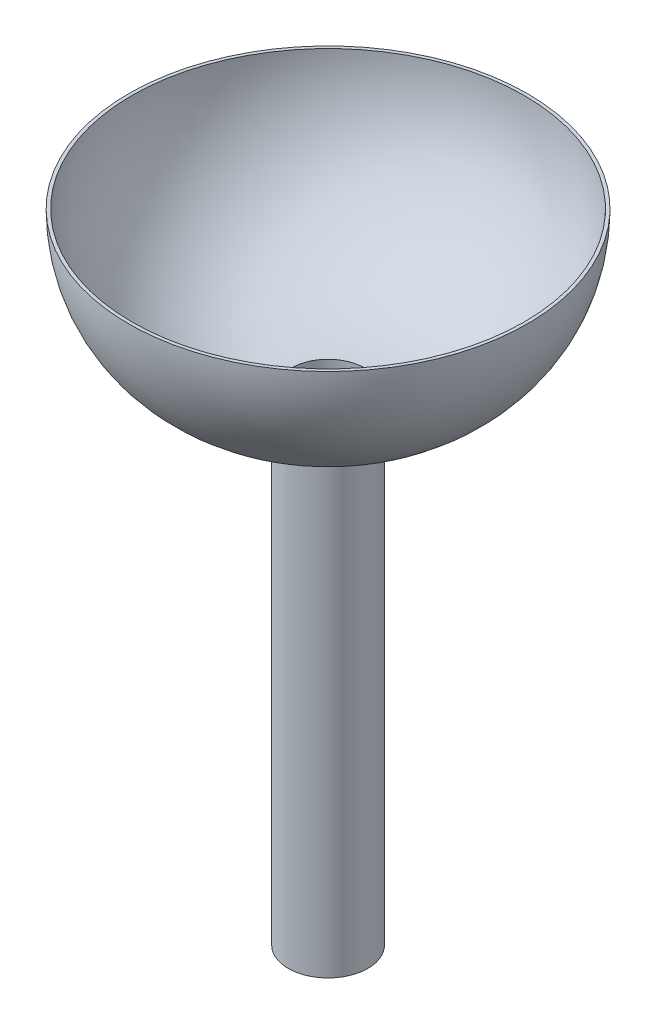
ISO-10303-21;
HEADER;
FILE_DESCRIPTION(('STEP AP214'),'2;1');
FILE_NAME('part.step','',(''),(''),'','','');
FILE_SCHEMA(('AUTOMOTIVE_DESIGN { 1 0 10303 214 1 1 1 1 }'));
ENDSEC;
DATA;
#1=APPLICATION_CONTEXT('core data for automotive mechanical design processes');
#2=APPLICATION_PROTOCOL_DEFINITION('international standard','automotive_design',2000,#1);
#3=PRODUCT_CONTEXT('',#1,'mechanical');
#4=PRODUCT('Part','Part','',(#3));
#5=PRODUCT_RELATED_PRODUCT_CATEGORY('part','',(#4));
#6=PRODUCT_DEFINITION_FORMATION('','',#4);
#7=PRODUCT_DEFINITION_CONTEXT('part definition',#1,'design');
#8=PRODUCT_DEFINITION('design','',#6,#7);
#9=PRODUCT_DEFINITION_SHAPE('','',#8);
#10=(LENGTH_UNIT() NAMED_UNIT(*) SI_UNIT(.MILLI.,.METRE.));
#11=(NAMED_UNIT(*) PLANE_ANGLE_UNIT() SI_UNIT($,.RADIAN.));
#12=(NAMED_UNIT(*) SI_UNIT($,.STERADIAN.) SOLID_ANGLE_UNIT());
#13=UNCERTAINTY_MEASURE_WITH_UNIT(LENGTH_MEASURE(1.E-05),#10,'distance_accuracy_value','');
#14=(GEOMETRIC_REPRESENTATION_CONTEXT(3) GLOBAL_UNCERTAINTY_ASSIGNED_CONTEXT((#13)) GLOBAL_UNIT_ASSIGNED_CONTEXT((#10,
#11,#12)) REPRESENTATION_CONTEXT('',''));
#15=CARTESIAN_POINT('',(0.,0.,0.));
#16=DIRECTION('',(0.,0.,1.));
#17=DIRECTION('',(1.,0.,0.));
#18=AXIS2_PLACEMENT_3D('',#15,#16,#17);
#19=CARTESIAN_POINT('',(-31.7500000000001,0.,0.));
#20=DIRECTION('',(0.,0.999999999999999,0.));
#21=DIRECTION('',(0.,0.,1.));
#22=AXIS2_PLACEMENT_3D('',#19,#20,#21);
#23=PLANE('',#22);
#24=CARTESIAN_POINT('',(-31.7500000000001,0.,0.));
#25=DIRECTION('',(0.,0.999999999999999,0.));
#26=DIRECTION('',(0.,0.,1.));
#27=AXIS2_PLACEMENT_3D('',#24,#25,#26);
#28=CIRCLE('',#27,156.21);
#29=CARTESIAN_POINT('',(-31.7500000000001,0.,156.21));
#30=VERTEX_POINT('',#29);
#31=EDGE_CURVE('E74',#30,#30,#28,.F.);
#32=ORIENTED_EDGE('',*,*,#31,.T.);
#33=EDGE_LOOP('',(#32));
#34=FACE_BOUND('',#33,.T.);
#35=CARTESIAN_POINT('',(-31.7500000000001,0.,0.));
#36=DIRECTION('',(0.,-0.999999999999999,0.));
#37=DIRECTION('',(0.,0.,-1.));
#38=AXIS2_PLACEMENT_3D('',#35,#36,#37);
#39=CIRCLE('',#38,158.75);
#40=CARTESIAN_POINT('',(-31.7500000000001,0.,-158.75));
#41=VERTEX_POINT('',#40);
#42=EDGE_CURVE('E12',#41,#41,#39,.T.);
#43=ORIENTED_EDGE('',*,*,#42,.F.);
#44=EDGE_LOOP('',(#43));
#45=FACE_BOUND('',#44,.T.);
#46=ADVANCED_FACE('F55',(#34,#45),#23,.T.);
#47=CARTESIAN_POINT('',(-31.7500000000001,0.,0.));
#48=DIRECTION('',(0.,-0.999999999999999,0.));
#49=DIRECTION('',(0.,0.,-1.));
#50=AXIS2_PLACEMENT_3D('',#47,#48,#49);
#51=DEGENERATE_TOROIDAL_SURFACE('',#50,31.75,127.,.T.);
#52=ORIENTED_EDGE('',*,*,#42,.T.);
#53=EDGE_LOOP('',(#52));
#54=FACE_BOUND('',#53,.T.);
#55=CARTESIAN_POINT('',(-31.7500000000001,-127.,1.66533453693773E-13));
#56=DIRECTION('',(0.,-0.999999999999999,0.));
#57=DIRECTION('',(0.,0.,-1.));
#58=AXIS2_PLACEMENT_3D('',#55,#56,#57);
#59=CIRCLE('',#58,31.75);
#60=CARTESIAN_POINT('',(-31.7500000000001,-127.,-31.7500000000001));
#61=VERTEX_POINT('',#60);
#62=EDGE_CURVE('E62',#61,#61,#59,.T.);
#63=ORIENTED_EDGE('',*,*,#62,.F.);
#64=EDGE_LOOP('',(#63));
#65=FACE_BOUND('',#64,.T.);
#66=ADVANCED_FACE('F106',(#54,#65),#51,.T.);
#67=CARTESIAN_POINT('',(-31.7500000000001,-507.999999999999,0.));
#68=DIRECTION('',(0.,-0.999999999999999,0.));
#69=DIRECTION('',(0.,0.,-1.));
#70=AXIS2_PLACEMENT_3D('',#67,#68,#69);
#71=CYLINDRICAL_SURFACE('',#70,31.75);
#72=CARTESIAN_POINT('',(-31.7500000000001,-507.999999999999,0.));
#73=DIRECTION('',(0.,-0.999999999999999,0.));
#74=DIRECTION('',(0.,0.,-1.));
#75=AXIS2_PLACEMENT_3D('',#72,#73,#74);
#76=CIRCLE('',#75,31.75);
#77=CARTESIAN_POINT('',(-31.7500000000001,-507.999999999999,-31.7500000000001));
#78=VERTEX_POINT('',#77);
#79=EDGE_CURVE('E68',#78,#78,#76,.T.);
#80=CARTESIAN_POINT('',(-31.7500000000001,-127.,-31.7500000000001));
#81=CARTESIAN_POINT('',(-31.7500000000001,-130.96875,-31.7500000000001));
#82=CARTESIAN_POINT('',(-31.7500000000001,-134.9375,-31.7500000000001));
#83=CARTESIAN_POINT('',(-31.7500000000001,-142.875,-31.7500000000001));
#84=CARTESIAN_POINT('',(-31.7500000000001,-146.84375,-31.7500000000001));
#85=CARTESIAN_POINT('',(-31.7500000000001,-154.78125,-31.7500000000001));
#86=CARTESIAN_POINT('',(-31.7500000000001,-158.75,-31.7500000000001));
#87=CARTESIAN_POINT('',(-31.7500000000001,-166.6875,-31.7500000000001));
#88=CARTESIAN_POINT('',(-31.7500000000001,-170.65625,-31.7500000000001));
#89=CARTESIAN_POINT('',(-31.7500000000001,-178.59375,-31.7500000000001));
#90=CARTESIAN_POINT('',(-31.7500000000001,-182.5625,-31.7500000000001));
#91=CARTESIAN_POINT('',(-31.7500000000001,-190.5,-31.7500000000001));
#92=CARTESIAN_POINT('',(-31.7500000000001,-194.46875,-31.7500000000001));
#93=CARTESIAN_POINT('',(-31.7500000000001,-202.40625,-31.7500000000001));
#94=CARTESIAN_POINT('',(-31.7500000000001,-206.375,-31.7500000000001));
#95=CARTESIAN_POINT('',(-31.7500000000001,-214.3125,-31.7500000000001));
#96=CARTESIAN_POINT('',(-31.7500000000001,-218.28125,-31.7500000000001));
#97=CARTESIAN_POINT('',(-31.7500000000001,-226.21875,-31.7500000000001));
#98=CARTESIAN_POINT('',(-31.7500000000001,-230.1875,-31.7500000000001));
#99=CARTESIAN_POINT('',(-31.7500000000001,-238.125,-31.7500000000001));
#100=CARTESIAN_POINT('',(-31.7500000000001,-242.09375,-31.7500000000001));
#101=CARTESIAN_POINT('',(-31.7500000000001,-250.03125,-31.7500000000001));
#102=CARTESIAN_POINT('',(-31.7500000000001,-254.,-31.7500000000001));
#103=CARTESIAN_POINT('',(-31.7500000000001,-261.937499999999,-31.7500000000001));
#104=CARTESIAN_POINT('',(-31.7500000000001,-265.906249999999,-31.7500000000001));
#105=CARTESIAN_POINT('',(-31.7500000000001,-273.843749999999,-31.7500000000001));
#106=CARTESIAN_POINT('',(-31.7500000000001,-277.812499999999,-31.7500000000001));
#107=CARTESIAN_POINT('',(-31.7500000000001,-285.749999999999,-31.7500000000001));
#108=CARTESIAN_POINT('',(-31.7500000000001,-289.718749999999,-31.7500000000001));
#109=CARTESIAN_POINT('',(-31.7500000000001,-297.656249999999,-31.7500000000001));
#110=CARTESIAN_POINT('',(-31.7500000000001,-301.624999999999,-31.7500000000001));
#111=CARTESIAN_POINT('',(-31.7500000000001,-309.562499999999,-31.7500000000001));
#112=CARTESIAN_POINT('',(-31.7500000000001,-313.531249999999,-31.7500000000001));
#113=CARTESIAN_POINT('',(-31.7500000000001,-321.468749999999,-31.7500000000001));
#114=CARTESIAN_POINT('',(-31.7500000000001,-325.437499999999,-31.7500000000001));
#115=CARTESIAN_POINT('',(-31.7500000000001,-333.374999999999,-31.7500000000001));
#116=CARTESIAN_POINT('',(-31.7500000000001,-337.343749999999,-31.7500000000001));
#117=CARTESIAN_POINT('',(-31.7500000000001,-345.281249999999,-31.7500000000001));
#118=CARTESIAN_POINT('',(-31.7500000000001,-349.249999999999,-31.7500000000001));
#119=CARTESIAN_POINT('',(-31.7500000000001,-357.187499999999,-31.7500000000001));
#120=CARTESIAN_POINT('',(-31.7500000000001,-361.156249999999,-31.7500000000001));
#121=CARTESIAN_POINT('',(-31.7500000000001,-369.093749999999,-31.7500000000001));
#122=CARTESIAN_POINT('',(-31.7500000000001,-373.062499999999,-31.7500000000001));
#123=CARTESIAN_POINT('',(-31.7500000000001,-380.999999999999,-31.7500000000001));
#124=CARTESIAN_POINT('',(-31.7500000000001,-384.968749999999,-31.7500000000001));
#125=CARTESIAN_POINT('',(-31.7500000000001,-392.906249999999,-31.7500000000001));
#126=CARTESIAN_POINT('',(-31.7500000000001,-396.874999999999,-31.7500000000001));
#127=CARTESIAN_POINT('',(-31.7500000000001,-404.812499999999,-31.7500000000001));
#128=CARTESIAN_POINT('',(-31.7500000000001,-408.781249999999,-31.7500000000001));
#129=CARTESIAN_POINT('',(-31.7500000000001,-416.718749999999,-31.7500000000001));
#130=CARTESIAN_POINT('',(-31.7500000000001,-420.687499999999,-31.7500000000001));
#131=CARTESIAN_POINT('',(-31.7500000000001,-428.624999999999,-31.7500000000001));
#132=CARTESIAN_POINT('',(-31.7500000000001,-432.593749999999,-31.7500000000001));
#133=CARTESIAN_POINT('',(-31.7500000000001,-440.531249999999,-31.7500000000001));
#134=CARTESIAN_POINT('',(-31.7500000000001,-444.499999999999,-31.7500000000001));
#135=CARTESIAN_POINT('',(-31.7500000000001,-452.437499999999,-31.7500000000001));
#136=CARTESIAN_POINT('',(-31.7500000000001,-456.406249999999,-31.7500000000001));
#137=CARTESIAN_POINT('',(-31.7500000000001,-464.343749999999,-31.7500000000001));
#138=CARTESIAN_POINT('',(-31.7500000000001,-468.312499999999,-31.7500000000001));
#139=CARTESIAN_POINT('',(-31.7500000000001,-476.249999999999,-31.7500000000001));
#140=CARTESIAN_POINT('',(-31.7500000000001,-480.218749999999,-31.7500000000001));
#141=CARTESIAN_POINT('',(-31.7500000000001,-488.156249999999,-31.7500000000001));
#142=CARTESIAN_POINT('',(-31.7500000000001,-492.124999999999,-31.7500000000001));
#143=CARTESIAN_POINT('',(-31.7500000000001,-500.062499999999,-31.7500000000001));
#144=CARTESIAN_POINT('',(-31.7500000000001,-504.031249999999,-31.7500000000001));
#145=CARTESIAN_POINT('',(-31.7500000000001,-507.999999999999,-31.7500000000001));
#146=B_SPLINE_CURVE_WITH_KNOTS('',3,(#80,#81,#82,#83,#84,#85,#86,#87,#88,#89,#90,#91,#92,#93,
#94,#95,#96,#97,#98,#99,#100,#101,#102,#103,#104,#105,#106,#107,#108,#109,#110,#111,#112,#113,
#114,#115,#116,#117,#118,#119,#120,#121,#122,#123,#124,#125,#126,#127,#128,#129,#130,#131,#132,
#133,#134,#135,#136,#137,#138,#139,#140,#141,#142,#143,#144,#145),.UNSPECIFIED.,.F.,.F.,(4,2,2,
2,2,2,2,2,2,2,2,2,2,2,2,2,2,2,2,2,2,2,2,2,2,2,2,2,2,2,2,2,4),(0.,11.90625,23.8125,
35.7187499999999,47.6249999999999,59.5312499999998,71.4374999999997,83.3437499999997,
95.2499999999997,107.15625,119.0625,130.96875,142.874999999999,154.781249999999,
166.687499999999,178.593749999999,190.499999999999,202.406249999999,214.312499999999,
226.218749999999,238.124999999999,250.031249999999,261.937499999999,273.843749999999,
285.749999999999,297.656249999999,309.562499999999,321.468749999999,333.374999999999,
345.281249999999,357.187499999999,369.093749999999,380.999999999999),.UNSPECIFIED.);
#147=EDGE_CURVE('BSEAM101',#61,#78,#146,.T.);
#148=ORIENTED_EDGE('',*,*,#62,.T.);
#149=ORIENTED_EDGE('',*,*,#79,.F.);
#150=ORIENTED_EDGE('',*,*,#147,.T.);
#151=ORIENTED_EDGE('',*,*,#147,.F.);
#152=EDGE_LOOP('',(#148,#150,#149,#151));
#153=FACE_BOUND('',#152,.T.);
#154=ADVANCED_FACE('F101',(#153),#71,.T.);
#155=CARTESIAN_POINT('',(-31.7500000000001,-507.999999999999,0.));
#156=DIRECTION('',(0.,-0.999999999999999,0.));
#157=DIRECTION('',(0.,0.,-1.));
#158=AXIS2_PLACEMENT_3D('',#155,#156,#157);
#159=PLANE('',#158);
#160=CARTESIAN_POINT('',(-31.7500000000001,-507.999999999999,0.));
#161=DIRECTION('',(0.,-0.999999999999999,0.));
#162=DIRECTION('',(0.,0.,-1.));
#163=AXIS2_PLACEMENT_3D('',#160,#161,#162);
#164=CIRCLE('',#163,29.21);
#165=CARTESIAN_POINT('',(-31.7500000000001,-507.999999999999,-29.2100000000001));
#166=VERTEX_POINT('',#165);
#167=EDGE_CURVE('E77',#166,#166,#164,.T.);
#168=ORIENTED_EDGE('',*,*,#167,.F.);
#169=EDGE_LOOP('',(#168));
#170=FACE_BOUND('',#169,.T.);
#171=ORIENTED_EDGE('',*,*,#79,.T.);
#172=EDGE_LOOP('',(#171));
#173=FACE_BOUND('',#172,.T.);
#174=ADVANCED_FACE('F98',(#170,#173),#159,.T.);
#175=CARTESIAN_POINT('',(-31.7500000000001,0.,0.));
#176=DIRECTION('',(0.,-0.999999999999999,0.));
#177=DIRECTION('',(0.,0.,-1.));
#178=AXIS2_PLACEMENT_3D('',#175,#176,#177);
#179=DEGENERATE_TOROIDAL_SURFACE('',#178,31.75,124.46,.T.);
#180=ORIENTED_EDGE('',*,*,#31,.F.);
#181=EDGE_LOOP('',(#180));
#182=FACE_BOUND('',#181,.T.);
#183=CARTESIAN_POINT('',(-31.7500000000001,-124.434078933385,1.66533453693773E-13));
#184=DIRECTION('',(0.,0.999999999999999,0.));
#185=DIRECTION('',(0.,0.,1.));
#186=AXIS2_PLACEMENT_3D('',#183,#184,#185);
#187=CIRCLE('',#186,29.21);
#188=CARTESIAN_POINT('',(-31.7500000000001,-124.434078933385,-29.2100000000001));
#189=VERTEX_POINT('',#188);
#190=EDGE_CURVE('E81',#189,#189,#187,.F.);
#191=ORIENTED_EDGE('',*,*,#190,.T.);
#192=EDGE_LOOP('',(#191));
#193=FACE_BOUND('',#192,.T.);
#194=ADVANCED_FACE('F90',(#182,#193),#179,.F.);
#195=CARTESIAN_POINT('',(-31.7500000000001,-507.999999999999,0.));
#196=DIRECTION('',(0.,-0.999999999999999,0.));
#197=DIRECTION('',(0.,0.,-1.));
#198=AXIS2_PLACEMENT_3D('',#195,#196,#197);
#199=CYLINDRICAL_SURFACE('',#198,29.21);
#200=CARTESIAN_POINT('',(-31.7500000000001,-124.434078933385,-29.2100000000001));
#201=CARTESIAN_POINT('',(-31.7500000000001,-128.429557277829,-29.2100000000001));
#202=CARTESIAN_POINT('',(-31.7500000000001,-132.425035622273,-29.2100000000001));
#203=CARTESIAN_POINT('',(-31.7500000000001,-140.415992311161,-29.2100000000001));
#204=CARTESIAN_POINT('',(-31.7500000000001,-144.411470655605,-29.2100000000001));
#205=CARTESIAN_POINT('',(-31.7500000000001,-152.402427344493,-29.2100000000001));
#206=CARTESIAN_POINT('',(-31.7500000000001,-156.397905688936,-29.2100000000001));
#207=CARTESIAN_POINT('',(-31.7500000000001,-164.388862377824,-29.2100000000001));
#208=CARTESIAN_POINT('',(-31.7500000000001,-168.384340722268,-29.2100000000001));
#209=CARTESIAN_POINT('',(-31.7500000000001,-176.375297411156,-29.2100000000001));
#210=CARTESIAN_POINT('',(-31.7500000000001,-180.3707757556,-29.2100000000001));
#211=CARTESIAN_POINT('',(-31.7500000000001,-188.361732444488,-29.2100000000001));
#212=CARTESIAN_POINT('',(-31.7500000000001,-192.357210788931,-29.2100000000001));
#213=CARTESIAN_POINT('',(-31.7500000000001,-200.348167477819,-29.2100000000001));
#214=CARTESIAN_POINT('',(-31.7500000000001,-204.343645822263,-29.2100000000001));
#215=CARTESIAN_POINT('',(-31.7500000000001,-212.334602511151,-29.2100000000001));
#216=CARTESIAN_POINT('',(-31.7500000000001,-216.330080855595,-29.2100000000001));
#217=CARTESIAN_POINT('',(-31.7500000000001,-224.321037544483,-29.2100000000001));
#218=CARTESIAN_POINT('',(-31.7500000000001,-228.316515888927,-29.2100000000001));
#219=CARTESIAN_POINT('',(-31.7500000000001,-236.307472577814,-29.2100000000001));
#220=CARTESIAN_POINT('',(-31.7500000000001,-240.302950922258,-29.2100000000001));
#221=CARTESIAN_POINT('',(-31.7500000000001,-248.293907611146,-29.2100000000001));
#222=CARTESIAN_POINT('',(-31.7500000000001,-252.28938595559,-29.2100000000001));
#223=CARTESIAN_POINT('',(-31.7500000000001,-260.280342644478,-29.2100000000001));
#224=CARTESIAN_POINT('',(-31.7500000000001,-264.275820988922,-29.2100000000001));
#225=CARTESIAN_POINT('',(-31.7500000000001,-272.266777677809,-29.2100000000001));
#226=CARTESIAN_POINT('',(-31.7500000000001,-276.262256022253,-29.2100000000001));
#227=CARTESIAN_POINT('',(-31.7500000000001,-284.253212711141,-29.2100000000001));
#228=CARTESIAN_POINT('',(-31.7500000000001,-288.248691055585,-29.2100000000001));
#229=CARTESIAN_POINT('',(-31.7500000000001,-296.239647744473,-29.2100000000001));
#230=CARTESIAN_POINT('',(-31.7500000000001,-300.235126088916,-29.2100000000001));
#231=CARTESIAN_POINT('',(-31.7500000000001,-308.226082777804,-29.2100000000001));
#232=CARTESIAN_POINT('',(-31.7500000000001,-312.221561122248,-29.2100000000001));
#233=CARTESIAN_POINT('',(-31.7500000000001,-320.212517811136,-29.2100000000001));
#234=CARTESIAN_POINT('',(-31.7500000000001,-324.20799615558,-29.2100000000001));
#235=CARTESIAN_POINT('',(-31.7500000000001,-332.198952844468,-29.2100000000001));
#236=CARTESIAN_POINT('',(-31.7500000000001,-336.194431188911,-29.2100000000001));
#237=CARTESIAN_POINT('',(-31.7500000000001,-344.185387877799,-29.2100000000001));
#238=CARTESIAN_POINT('',(-31.7500000000001,-348.180866222243,-29.2100000000001));
#239=CARTESIAN_POINT('',(-31.7500000000001,-356.171822911131,-29.2100000000001));
#240=CARTESIAN_POINT('',(-31.7500000000001,-360.167301255575,-29.2100000000001));
#241=CARTESIAN_POINT('',(-31.7500000000001,-368.158257944463,-29.2100000000001));
#242=CARTESIAN_POINT('',(-31.7500000000001,-372.153736288906,-29.2100000000001));
#243=CARTESIAN_POINT('',(-31.7500000000001,-380.144692977794,-29.2100000000001));
#244=CARTESIAN_POINT('',(-31.7500000000001,-384.140171322238,-29.2100000000001));
#245=CARTESIAN_POINT('',(-31.7500000000001,-392.131128011126,-29.2100000000001));
#246=CARTESIAN_POINT('',(-31.7500000000001,-396.12660635557,-29.2100000000001));
#247=CARTESIAN_POINT('',(-31.7500000000001,-404.117563044457,-29.2100000000001));
#248=CARTESIAN_POINT('',(-31.7500000000001,-408.113041388901,-29.2100000000001));
#249=CARTESIAN_POINT('',(-31.7500000000001,-416.103998077789,-29.2100000000001));
#250=CARTESIAN_POINT('',(-31.7500000000001,-420.099476422233,-29.2100000000001));
#251=CARTESIAN_POINT('',(-31.7500000000001,-428.090433111121,-29.2100000000001));
#252=CARTESIAN_POINT('',(-31.7500000000001,-432.085911455565,-29.2100000000001));
#253=CARTESIAN_POINT('',(-31.7500000000001,-440.076868144453,-29.2100000000001));
#254=CARTESIAN_POINT('',(-31.7500000000001,-444.072346488896,-29.2100000000001));
#255=CARTESIAN_POINT('',(-31.7500000000001,-452.063303177784,-29.2100000000001));
#256=CARTESIAN_POINT('',(-31.7500000000001,-456.058781522228,-29.2100000000001));
#257=CARTESIAN_POINT('',(-31.7500000000001,-464.049738211116,-29.2100000000001));
#258=CARTESIAN_POINT('',(-31.7500000000001,-468.04521655556,-29.2100000000001));
#259=CARTESIAN_POINT('',(-31.7500000000001,-476.036173244448,-29.2100000000001));
#260=CARTESIAN_POINT('',(-31.7500000000001,-480.031651588891,-29.2100000000001));
#261=CARTESIAN_POINT('',(-31.7500000000001,-488.022608277779,-29.2100000000001));
#262=CARTESIAN_POINT('',(-31.7500000000001,-492.018086622223,-29.2100000000001));
#263=CARTESIAN_POINT('',(-31.7500000000001,-500.009043311111,-29.2100000000001));
#264=CARTESIAN_POINT('',(-31.7500000000001,-504.004521655555,-29.2100000000001));
#265=CARTESIAN_POINT('',(-31.7500000000001,-507.999999999999,-29.2100000000001));
#266=B_SPLINE_CURVE_WITH_KNOTS('',3,(#200,#201,#202,#203,#204,#205,#206,#207,#208,#209,#210,
#211,#212,#213,#214,#215,#216,#217,#218,#219,#220,#221,#222,#223,#224,#225,#226,#227,#228,#229,
#230,#231,#232,#233,#234,#235,#236,#237,#238,#239,#240,#241,#242,#243,#244,#245,#246,#247,#248,
#249,#250,#251,#252,#253,#254,#255,#256,#257,#258,#259,#260,#261,#262,#263,#264,#265),
.UNSPECIFIED.,.F.,.F.,(4,2,2,2,2,2,2,2,2,2,2,2,2,2,2,2,2,2,2,2,2,2,2,2,2,2,2,2,2,2,2,2,4),(0.,
11.9864350333317,23.9728700666634,35.959305099995,47.9457401333266,59.9321751666583,
71.91861019999,83.9050452333217,95.8914802666533,107.877915299985,119.864350333317,
131.850785366648,143.83722039998,155.823655433312,167.810090466643,179.796525499975,
191.782960533307,203.769395566638,215.75583059997,227.742265633302,239.728700666633,
251.715135699965,263.701570733297,275.688005766628,287.67444079996,299.660875833292,
311.647310866623,323.633745899955,335.620180933287,347.606615966618,359.59305099995,
371.579486033282,383.565921066613),.UNSPECIFIED.);
#267=EDGE_CURVE('BSEAM92',#189,#166,#266,.T.);
#268=ORIENTED_EDGE('',*,*,#190,.F.);
#269=ORIENTED_EDGE('',*,*,#167,.T.);
#270=ORIENTED_EDGE('',*,*,#267,.T.);
#271=ORIENTED_EDGE('',*,*,#267,.F.);
#272=EDGE_LOOP('',(#268,#270,#269,#271));
#273=FACE_BOUND('',#272,.T.);
#274=ADVANCED_FACE('F92',(#273),#199,.F.);
#275=CLOSED_SHELL('',(#46,#66,#154,#174,#194,#274));
#276=MANIFOLD_SOLID_BREP('B2',#275);
#277=ADVANCED_BREP_SHAPE_REPRESENTATION('',(#18,#276),#14);
#278=SHAPE_DEFINITION_REPRESENTATION(#9,#277);
ENDSEC;
END-ISO-10303-21;
